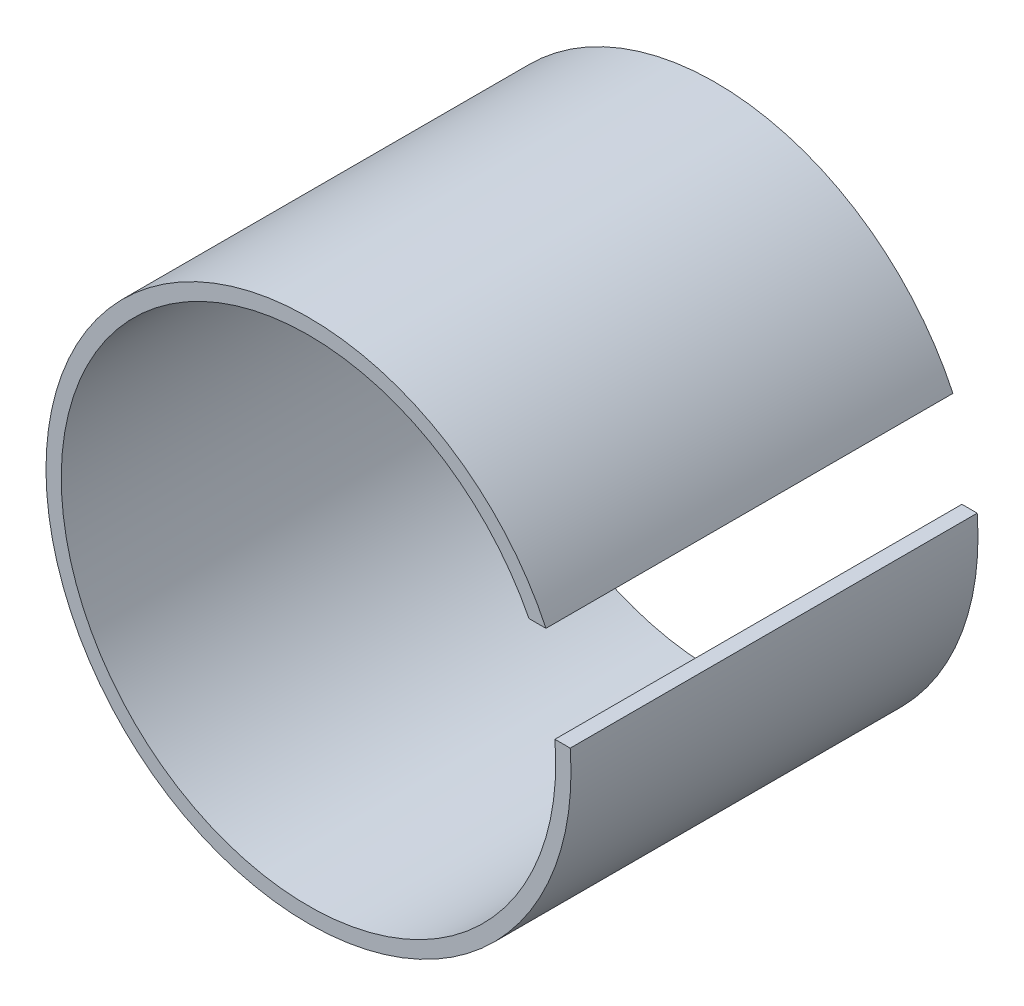
ISO-10303-21;
HEADER;
FILE_DESCRIPTION(('STEP AP214'),'2;1');
FILE_NAME('part.step','',(''),(''),'','','');
FILE_SCHEMA(('AUTOMOTIVE_DESIGN { 1 0 10303 214 1 1 1 1 }'));
ENDSEC;
DATA;
#1=APPLICATION_CONTEXT('core data for automotive mechanical design processes');
#2=APPLICATION_PROTOCOL_DEFINITION('international standard','automotive_design',2000,#1);
#3=PRODUCT_CONTEXT('',#1,'mechanical');
#4=PRODUCT('Part','Part','',(#3));
#5=PRODUCT_RELATED_PRODUCT_CATEGORY('part','',(#4));
#6=PRODUCT_DEFINITION_FORMATION('','',#4);
#7=PRODUCT_DEFINITION_CONTEXT('part definition',#1,'design');
#8=PRODUCT_DEFINITION('design','',#6,#7);
#9=PRODUCT_DEFINITION_SHAPE('','',#8);
#10=(LENGTH_UNIT() NAMED_UNIT(*) SI_UNIT(.MILLI.,.METRE.));
#11=(NAMED_UNIT(*) PLANE_ANGLE_UNIT() SI_UNIT($,.RADIAN.));
#12=(NAMED_UNIT(*) SI_UNIT($,.STERADIAN.) SOLID_ANGLE_UNIT());
#13=UNCERTAINTY_MEASURE_WITH_UNIT(LENGTH_MEASURE(1.E-05),#10,'distance_accuracy_value','');
#14=(GEOMETRIC_REPRESENTATION_CONTEXT(3) GLOBAL_UNCERTAINTY_ASSIGNED_CONTEXT((#13)) GLOBAL_UNIT_ASSIGNED_CONTEXT((#10,
#11,#12)) REPRESENTATION_CONTEXT('',''));
#15=CARTESIAN_POINT('',(0.,0.,0.));
#16=DIRECTION('',(0.,0.,1.));
#17=DIRECTION('',(1.,0.,0.));
#18=AXIS2_PLACEMENT_3D('',#15,#16,#17);
#19=CARTESIAN_POINT('',(0.,11.,40.));
#20=DIRECTION('',(0.,1.,0.));
#21=DIRECTION('',(0.,0.,1.));
#22=AXIS2_PLACEMENT_3D('',#19,#20,#21);
#23=PLANE('',#22);
#24=DIRECTION('',(1.,0.,0.));
#25=VECTOR('',#24,1.);
#26=CARTESIAN_POINT('',(0.,11.,0.));
#27=LINE('',#26,#25);
#28=CARTESIAN_POINT('',(21.6677179232147,11.,0.));
#29=VERTEX_POINT('',#28);
#30=CARTESIAN_POINT('',(23.3375234333037,11.,0.));
#31=VERTEX_POINT('',#30);
#32=EDGE_CURVE('E100',#29,#31,#27,.T.);
#33=ORIENTED_EDGE('',*,*,#32,.T.);
#34=DIRECTION('',(0.,0.,-1.));
#35=VECTOR('',#34,1.);
#36=CARTESIAN_POINT('',(23.3375234333037,11.,40.));
#37=LINE('',#36,#35);
#38=CARTESIAN_POINT('',(23.3375234333037,11.,40.));
#39=VERTEX_POINT('',#38);
#40=EDGE_CURVE('E11',#39,#31,#37,.T.);
#41=ORIENTED_EDGE('',*,*,#40,.F.);
#42=DIRECTION('',(1.,0.,0.));
#43=VECTOR('',#42,1.);
#44=CARTESIAN_POINT('',(0.,11.,40.));
#45=LINE('',#44,#43);
#46=CARTESIAN_POINT('',(21.6677179232147,11.,40.));
#47=VERTEX_POINT('',#46);
#48=EDGE_CURVE('E86',#47,#39,#45,.T.);
#49=ORIENTED_EDGE('',*,*,#48,.F.);
#50=DIRECTION('',(0.,0.,-1.));
#51=VECTOR('',#50,1.);
#52=CARTESIAN_POINT('',(21.6677179232147,11.,40.));
#53=LINE('',#52,#51);
#54=EDGE_CURVE('E53',#47,#29,#53,.T.);
#55=ORIENTED_EDGE('',*,*,#54,.T.);
#56=EDGE_LOOP('',(#33,#41,#49,#55));
#57=FACE_BOUND('',#56,.T.);
#58=ADVANCED_FACE('F37',(#57),#23,.F.);
#59=CARTESIAN_POINT('',(0.,0.,40.));
#60=DIRECTION('',(0.,0.,-1.));
#61=DIRECTION('',(-1.,0.,0.));
#62=AXIS2_PLACEMENT_3D('',#59,#60,#61);
#63=CYLINDRICAL_SURFACE('',#62,25.8);
#64=CARTESIAN_POINT('',(0.,0.,0.));
#65=DIRECTION('',(0.,0.,1.));
#66=DIRECTION('',(1.,0.,0.));
#67=AXIS2_PLACEMENT_3D('',#64,#65,#66);
#68=CIRCLE('',#67,25.8);
#69=CARTESIAN_POINT('',(25.7223638105054,2.,0.));
#70=VERTEX_POINT('',#69);
#71=EDGE_CURVE('E91',#31,#70,#68,.T.);
#72=ORIENTED_EDGE('',*,*,#71,.T.);
#73=DIRECTION('',(0.,0.,-1.));
#74=VECTOR('',#73,1.);
#75=CARTESIAN_POINT('',(25.7223638105054,2.,40.));
#76=LINE('',#75,#74);
#77=CARTESIAN_POINT('',(25.7223638105054,2.,40.));
#78=VERTEX_POINT('',#77);
#79=EDGE_CURVE('E45',#78,#70,#76,.T.);
#80=ORIENTED_EDGE('',*,*,#79,.F.);
#81=CARTESIAN_POINT('',(0.,0.,40.));
#82=DIRECTION('',(0.,0.,1.));
#83=DIRECTION('',(1.,0.,0.));
#84=AXIS2_PLACEMENT_3D('',#81,#82,#83);
#85=CIRCLE('',#84,25.8);
#86=EDGE_CURVE('E78',#39,#78,#85,.T.);
#87=ORIENTED_EDGE('',*,*,#86,.F.);
#88=ORIENTED_EDGE('',*,*,#40,.T.);
#89=EDGE_LOOP('',(#72,#80,#87,#88));
#90=FACE_BOUND('',#89,.T.);
#91=ADVANCED_FACE('F90',(#90),#63,.T.);
#92=CARTESIAN_POINT('',(0.,2.,40.));
#93=DIRECTION('',(0.,1.,0.));
#94=DIRECTION('',(0.,0.,1.));
#95=AXIS2_PLACEMENT_3D('',#92,#93,#94);
#96=PLANE('',#95);
#97=DIRECTION('',(1.,0.,0.));
#98=VECTOR('',#97,1.);
#99=CARTESIAN_POINT('',(0.,2.,0.));
#100=LINE('',#99,#98);
#101=CARTESIAN_POINT('',(24.2175556157099,2.,0.));
#102=VERTEX_POINT('',#101);
#103=EDGE_CURVE('E103',#102,#70,#100,.T.);
#104=ORIENTED_EDGE('',*,*,#103,.F.);
#105=DIRECTION('',(0.,0.,-1.));
#106=VECTOR('',#105,1.);
#107=CARTESIAN_POINT('',(24.2175556157099,2.,40.));
#108=LINE('',#107,#106);
#109=CARTESIAN_POINT('',(24.2175556157099,2.,40.));
#110=VERTEX_POINT('',#109);
#111=EDGE_CURVE('E67',#110,#102,#108,.T.);
#112=ORIENTED_EDGE('',*,*,#111,.F.);
#113=DIRECTION('',(1.,0.,0.));
#114=VECTOR('',#113,1.);
#115=CARTESIAN_POINT('',(0.,2.,40.));
#116=LINE('',#115,#114);
#117=EDGE_CURVE('E85',#110,#78,#116,.T.);
#118=ORIENTED_EDGE('',*,*,#117,.T.);
#119=ORIENTED_EDGE('',*,*,#79,.T.);
#120=EDGE_LOOP('',(#104,#112,#118,#119));
#121=FACE_BOUND('',#120,.T.);
#122=ADVANCED_FACE('F94',(#121),#96,.T.);
#123=CARTESIAN_POINT('',(0.,0.,40.));
#124=DIRECTION('',(0.,0.,-1.));
#125=DIRECTION('',(-1.,0.,0.));
#126=AXIS2_PLACEMENT_3D('',#123,#124,#125);
#127=CYLINDRICAL_SURFACE('',#126,24.3);
#128=CARTESIAN_POINT('',(0.,0.,0.));
#129=DIRECTION('',(0.,0.,1.));
#130=DIRECTION('',(1.,0.,0.));
#131=AXIS2_PLACEMENT_3D('',#128,#129,#130);
#132=CIRCLE('',#131,24.3);
#133=EDGE_CURVE('E105',#29,#102,#132,.T.);
#134=ORIENTED_EDGE('',*,*,#133,.F.);
#135=ORIENTED_EDGE('',*,*,#54,.F.);
#136=CARTESIAN_POINT('',(0.,0.,40.));
#137=DIRECTION('',(0.,0.,1.));
#138=DIRECTION('',(1.,0.,0.));
#139=AXIS2_PLACEMENT_3D('',#136,#137,#138);
#140=CIRCLE('',#139,24.3);
#141=EDGE_CURVE('E95',#47,#110,#140,.T.);
#142=ORIENTED_EDGE('',*,*,#141,.T.);
#143=ORIENTED_EDGE('',*,*,#111,.T.);
#144=EDGE_LOOP('',(#134,#135,#142,#143));
#145=FACE_BOUND('',#144,.T.);
#146=ADVANCED_FACE('F111',(#145),#127,.F.);
#147=CARTESIAN_POINT('',(0.,0.,40.));
#148=DIRECTION('',(0.,0.,1.));
#149=DIRECTION('',(1.,0.,0.));
#150=AXIS2_PLACEMENT_3D('',#147,#148,#149);
#151=PLANE('',#150);
#152=ORIENTED_EDGE('',*,*,#48,.T.);
#153=ORIENTED_EDGE('',*,*,#86,.T.);
#154=ORIENTED_EDGE('',*,*,#117,.F.);
#155=ORIENTED_EDGE('',*,*,#141,.F.);
#156=EDGE_LOOP('',(#152,#153,#154,#155));
#157=FACE_BOUND('',#156,.T.);
#158=ADVANCED_FACE('F82',(#157),#151,.T.);
#159=CARTESIAN_POINT('',(0.,0.,0.));
#160=DIRECTION('',(0.,0.,1.));
#161=DIRECTION('',(1.,0.,0.));
#162=AXIS2_PLACEMENT_3D('',#159,#160,#161);
#163=PLANE('',#162);
#164=ORIENTED_EDGE('',*,*,#32,.F.);
#165=ORIENTED_EDGE('',*,*,#133,.T.);
#166=ORIENTED_EDGE('',*,*,#103,.T.);
#167=ORIENTED_EDGE('',*,*,#71,.F.);
#168=EDGE_LOOP('',(#164,#165,#166,#167));
#169=FACE_BOUND('',#168,.T.);
#170=ADVANCED_FACE('F110',(#169),#163,.F.);
#171=CLOSED_SHELL('',(#58,#91,#122,#146,#158,#170));
#172=MANIFOLD_SOLID_BREP('B2',#171);
#173=ADVANCED_BREP_SHAPE_REPRESENTATION('',(#18,#172),#14);
#174=SHAPE_DEFINITION_REPRESENTATION(#9,#173);
ENDSEC;
END-ISO-10303-21;
